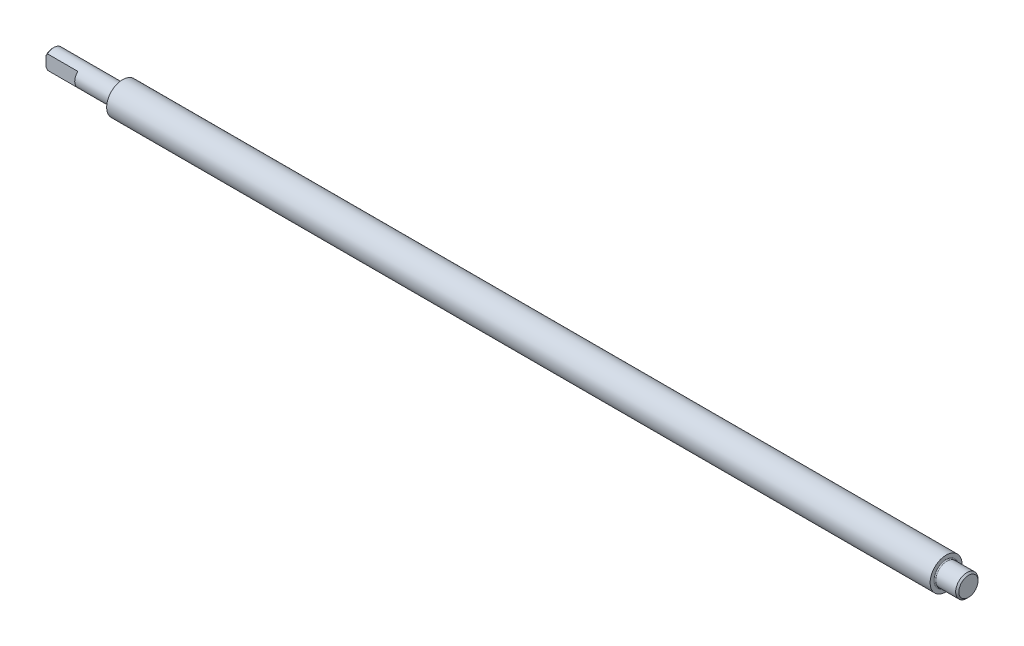
ISO-10303-21;
HEADER;
FILE_DESCRIPTION(('STEP AP214'),'2;1');
FILE_NAME('part.step','',(''),(''),'','','');
FILE_SCHEMA(('AUTOMOTIVE_DESIGN { 1 0 10303 214 1 1 1 1 }'));
ENDSEC;
DATA;
#1=APPLICATION_CONTEXT('core data for automotive mechanical design processes');
#2=APPLICATION_PROTOCOL_DEFINITION('international standard','automotive_design',2000,#1);
#3=PRODUCT_CONTEXT('',#1,'mechanical');
#4=PRODUCT('Part','Part','',(#3));
#5=PRODUCT_RELATED_PRODUCT_CATEGORY('part','',(#4));
#6=PRODUCT_DEFINITION_FORMATION('','',#4);
#7=PRODUCT_DEFINITION_CONTEXT('part definition',#1,'design');
#8=PRODUCT_DEFINITION('design','',#6,#7);
#9=PRODUCT_DEFINITION_SHAPE('','',#8);
#10=(LENGTH_UNIT() NAMED_UNIT(*) SI_UNIT(.MILLI.,.METRE.));
#11=(NAMED_UNIT(*) PLANE_ANGLE_UNIT() SI_UNIT($,.RADIAN.));
#12=(NAMED_UNIT(*) SI_UNIT($,.STERADIAN.) SOLID_ANGLE_UNIT());
#13=UNCERTAINTY_MEASURE_WITH_UNIT(LENGTH_MEASURE(1.E-05),#10,'distance_accuracy_value','');
#14=(GEOMETRIC_REPRESENTATION_CONTEXT(3) GLOBAL_UNCERTAINTY_ASSIGNED_CONTEXT((#13)) GLOBAL_UNIT_ASSIGNED_CONTEXT((#10,
#11,#12)) REPRESENTATION_CONTEXT('',''));
#15=CARTESIAN_POINT('',(0.,0.,0.));
#16=DIRECTION('',(0.,0.,1.));
#17=DIRECTION('',(1.,0.,0.));
#18=AXIS2_PLACEMENT_3D('',#15,#16,#17);
#19=CARTESIAN_POINT('',(280.,0.,0.));
#20=DIRECTION('',(1.,0.,0.));
#21=DIRECTION('',(0.,0.,-1.));
#22=AXIS2_PLACEMENT_3D('',#19,#20,#21);
#23=PLANE('',#22);
#24=CARTESIAN_POINT('',(280.,0.,0.));
#25=DIRECTION('',(1.,0.,0.));
#26=DIRECTION('',(0.,0.,-1.));
#27=AXIS2_PLACEMENT_3D('',#24,#25,#26);
#28=CIRCLE('',#27,3.79999999999988);
#29=CARTESIAN_POINT('',(280.,0.,-3.79999999999988));
#30=VERTEX_POINT('',#29);
#31=EDGE_CURVE('E11',#30,#30,#28,.F.);
#32=ORIENTED_EDGE('',*,*,#31,.T.);
#33=EDGE_LOOP('',(#32));
#34=FACE_BOUND('',#33,.T.);
#35=CARTESIAN_POINT('',(280.,0.,0.));
#36=DIRECTION('',(1.,0.,0.));
#37=DIRECTION('',(0.,0.,-1.));
#38=AXIS2_PLACEMENT_3D('',#35,#36,#37);
#39=CIRCLE('',#38,5.);
#40=CARTESIAN_POINT('',(280.,0.,-5.));
#41=VERTEX_POINT('',#40);
#42=EDGE_CURVE('E82',#41,#41,#39,.T.);
#43=ORIENTED_EDGE('',*,*,#42,.T.);
#44=EDGE_LOOP('',(#43));
#45=FACE_BOUND('',#44,.T.);
#46=ADVANCED_FACE('F33',(#34,#45),#23,.T.);
#47=CARTESIAN_POINT('',(22.,5.,0.));
#48=DIRECTION('',(-1.,0.,0.));
#49=DIRECTION('',(0.,0.,1.));
#50=AXIS2_PLACEMENT_3D('',#47,#48,#49);
#51=PLANE('',#50);
#52=CARTESIAN_POINT('',(22.,0.,0.));
#53=DIRECTION('',(-1.,0.,0.));
#54=DIRECTION('',(0.,0.,1.));
#55=AXIS2_PLACEMENT_3D('',#52,#53,#54);
#56=CIRCLE('',#55,3.29999999999989);
#57=CARTESIAN_POINT('',(22.,0.,3.29999999999989));
#58=VERTEX_POINT('',#57);
#59=EDGE_CURVE('E162',#58,#58,#56,.F.);
#60=ORIENTED_EDGE('',*,*,#59,.T.);
#61=EDGE_LOOP('',(#60));
#62=FACE_BOUND('',#61,.T.);
#63=CARTESIAN_POINT('',(22.,0.,0.));
#64=DIRECTION('',(1.,0.,0.));
#65=DIRECTION('',(0.,0.,-1.));
#66=AXIS2_PLACEMENT_3D('',#63,#64,#65);
#67=CIRCLE('',#66,5.);
#68=CARTESIAN_POINT('',(22.,0.,-5.));
#69=VERTEX_POINT('',#68);
#70=EDGE_CURVE('E88',#69,#69,#67,.T.);
#71=ORIENTED_EDGE('',*,*,#70,.F.);
#72=EDGE_LOOP('',(#71));
#73=FACE_BOUND('',#72,.T.);
#74=ADVANCED_FACE('F130',(#62,#73),#51,.T.);
#75=CARTESIAN_POINT('',(22.,0.,0.));
#76=DIRECTION('',(1.,0.,0.));
#77=DIRECTION('',(0.,0.,-1.));
#78=AXIS2_PLACEMENT_3D('',#75,#76,#77);
#79=CYLINDRICAL_SURFACE('',#78,5.);
#80=ORIENTED_EDGE('',*,*,#70,.T.);
#81=EDGE_LOOP('',(#80));
#82=FACE_BOUND('',#81,.T.);
#83=ORIENTED_EDGE('',*,*,#42,.F.);
#84=EDGE_LOOP('',(#83));
#85=FACE_BOUND('',#84,.T.);
#86=ADVANCED_FACE('F126',(#82,#85),#79,.T.);
#87=CARTESIAN_POINT('',(0.,0.,0.));
#88=DIRECTION('',(1.,0.,0.));
#89=DIRECTION('',(0.,0.,-1.));
#90=AXIS2_PLACEMENT_3D('',#87,#88,#89);
#91=CYLINDRICAL_SURFACE('',#90,3.);
#92=CARTESIAN_POINT('',(21.7000000000001,0.,0.));
#93=DIRECTION('',(-1.,0.,0.));
#94=DIRECTION('',(0.,0.,1.));
#95=AXIS2_PLACEMENT_3D('',#92,#93,#94);
#96=CIRCLE('',#95,3.);
#97=CARTESIAN_POINT('',(21.7000000000001,0.,3.));
#98=VERTEX_POINT('',#97);
#99=EDGE_CURVE('E164',#98,#98,#96,.T.);
#100=ORIENTED_EDGE('',*,*,#99,.T.);
#101=EDGE_LOOP('',(#100));
#102=FACE_BOUND('',#101,.T.);
#103=DIRECTION('',(-1.,0.,0.));
#104=VECTOR('',#103,1.);
#105=CARTESIAN_POINT('',(10.,-2.23606797749979,2.));
#106=LINE('',#105,#104);
#107=CARTESIAN_POINT('',(10.,-2.23606797749979,2.));
#108=VERTEX_POINT('',#107);
#109=CARTESIAN_POINT('',(0.50000000005802,-2.23606797749979,2.));
#110=VERTEX_POINT('',#109);
#111=EDGE_CURVE('E78',#108,#110,#106,.T.);
#112=ORIENTED_EDGE('',*,*,#111,.T.);
#113=CARTESIAN_POINT('',(0.50000000005802,0.,0.));
#114=DIRECTION('',(-1.,0.,0.));
#115=DIRECTION('',(0.,0.,1.));
#116=AXIS2_PLACEMENT_3D('',#113,#114,#115);
#117=CIRCLE('',#116,3.);
#118=CARTESIAN_POINT('',(0.50000000005802,2.23606797749979,2.));
#119=VERTEX_POINT('',#118);
#120=EDGE_CURVE('E48',#110,#119,#117,.F.);
#121=ORIENTED_EDGE('',*,*,#120,.T.);
#122=DIRECTION('',(-1.,0.,0.));
#123=VECTOR('',#122,1.);
#124=CARTESIAN_POINT('',(10.,2.23606797749979,2.));
#125=LINE('',#124,#123);
#126=CARTESIAN_POINT('',(10.,2.23606797749979,2.));
#127=VERTEX_POINT('',#126);
#128=EDGE_CURVE('E76',#127,#119,#125,.T.);
#129=ORIENTED_EDGE('',*,*,#128,.F.);
#130=CARTESIAN_POINT('',(10.,0.,0.));
#131=DIRECTION('',(-1.,0.,0.));
#132=DIRECTION('',(0.,0.,1.));
#133=AXIS2_PLACEMENT_3D('',#130,#131,#132);
#134=CIRCLE('',#133,3.);
#135=EDGE_CURVE('E69',#108,#127,#134,.T.);
#136=ORIENTED_EDGE('',*,*,#135,.F.);
#137=EDGE_LOOP('',(#112,#121,#129,#136));
#138=FACE_BOUND('',#137,.T.);
#139=ADVANCED_FACE('F80',(#102,#138),#91,.T.);
#140=CARTESIAN_POINT('',(0.,0.,0.));
#141=DIRECTION('',(-1.,0.,0.));
#142=DIRECTION('',(0.,0.,1.));
#143=AXIS2_PLACEMENT_3D('',#140,#141,#142);
#144=PLANE('',#143);
#145=DIRECTION('',(0.,-1.,0.));
#146=VECTOR('',#145,1.);
#147=CARTESIAN_POINT('',(0.,2.23606797749979,2.));
#148=LINE('',#147,#146);
#149=CARTESIAN_POINT('',(0.,1.49999999990333,2.));
#150=VERTEX_POINT('',#149);
#151=CARTESIAN_POINT('',(0.,-1.49999999990333,2.));
#152=VERTEX_POINT('',#151);
#153=EDGE_CURVE('E73',#150,#152,#148,.T.);
#154=ORIENTED_EDGE('',*,*,#153,.F.);
#155=CARTESIAN_POINT('',(0.,0.,0.));
#156=DIRECTION('',(-1.,0.,0.));
#157=DIRECTION('',(0.,0.,1.));
#158=AXIS2_PLACEMENT_3D('',#155,#156,#157);
#159=CIRCLE('',#158,2.49999999994199);
#160=EDGE_CURVE('E97',#150,#152,#159,.T.);
#161=ORIENTED_EDGE('',*,*,#160,.T.);
#162=EDGE_LOOP('',(#154,#161));
#163=FACE_BOUND('',#162,.T.);
#164=ADVANCED_FACE('F118',(#163),#144,.T.);
#165=CARTESIAN_POINT('',(10.,2.23606797749979,2.));
#166=DIRECTION('',(0.,0.,-1.));
#167=DIRECTION('',(-1.,0.,0.));
#168=AXIS2_PLACEMENT_3D('',#165,#166,#167);
#169=PLANE('',#168);
#170=ORIENTED_EDGE('',*,*,#153,.T.);
#171=CARTESIAN_POINT('',(0.,-1.49999999990332,2.));
#172=CARTESIAN_POINT('',(0.0382006778610119,-1.56363441032344,2.));
#173=CARTESIAN_POINT('',(0.077507964072937,-1.62658889890878,2.));
#174=CARTESIAN_POINT('',(0.157942702593237,-1.75127191091358,2.));
#175=CARTESIAN_POINT('',(0.199069024909245,-1.81300116186136,2.));
#176=CARTESIAN_POINT('',(0.282789469579817,-1.93543485249902,2.));
#177=CARTESIAN_POINT('',(0.325383344272779,-1.99613946255426,2.));
#178=CARTESIAN_POINT('',(0.411821773743562,-2.11670900844776,2.));
#179=CARTESIAN_POINT('',(0.45566707715367,-2.17657340830223,2.));
#180=CARTESIAN_POINT('',(0.500000000058021,-2.23606797749979,2.));
#181=B_SPLINE_CURVE_WITH_KNOTS('',3,(#171,#172,#173,#174,#175,#176,#177,#178,#179,#180),
.UNSPECIFIED.,.F.,.F.,(4,2,2,2,4),(0.,0.222629901950375,0.445123396105734,0.667579524802105,
0.890171642481118),.UNSPECIFIED.);
#182=EDGE_CURVE('E56',#152,#110,#181,.T.);
#183=ORIENTED_EDGE('',*,*,#182,.T.);
#184=ORIENTED_EDGE('',*,*,#111,.F.);
#185=DIRECTION('',(0.,-1.,0.));
#186=VECTOR('',#185,1.);
#187=CARTESIAN_POINT('',(10.,2.23606797749979,2.));
#188=LINE('',#187,#186);
#189=EDGE_CURVE('E72',#127,#108,#188,.T.);
#190=ORIENTED_EDGE('',*,*,#189,.F.);
#191=ORIENTED_EDGE('',*,*,#128,.T.);
#192=CARTESIAN_POINT('',(0.50000000005802,2.23606797749979,2.));
#193=CARTESIAN_POINT('',(0.45566707715367,2.17657340830223,2.));
#194=CARTESIAN_POINT('',(0.411821773743562,2.11670900844776,2.));
#195=CARTESIAN_POINT('',(0.325383344272779,1.99613946255426,2.));
#196=CARTESIAN_POINT('',(0.282789469579817,1.93543485249902,2.));
#197=CARTESIAN_POINT('',(0.199069024909245,1.81300116186136,2.));
#198=CARTESIAN_POINT('',(0.157942702593237,1.75127191091358,2.));
#199=CARTESIAN_POINT('',(0.0775079640729371,1.62658889890878,2.));
#200=CARTESIAN_POINT('',(0.0382006778610121,1.56363441032344,2.));
#201=CARTESIAN_POINT('',(0.,1.49999999990332,2.));
#202=B_SPLINE_CURVE_WITH_KNOTS('',3,(#192,#193,#194,#195,#196,#197,#198,#199,#200,#201),
.UNSPECIFIED.,.F.,.F.,(4,2,2,2,4),(0.,0.222592117679013,0.445048246375384,0.667541740530743,
0.890171642481118),.UNSPECIFIED.);
#203=EDGE_CURVE('E100',#119,#150,#202,.T.);
#204=ORIENTED_EDGE('',*,*,#203,.T.);
#205=EDGE_LOOP('',(#170,#183,#184,#190,#191,#204));
#206=FACE_BOUND('',#205,.T.);
#207=ADVANCED_FACE('F75',(#206),#169,.F.);
#208=CARTESIAN_POINT('',(10.,0.,0.));
#209=DIRECTION('',(-1.,0.,0.));
#210=DIRECTION('',(0.,0.,1.));
#211=AXIS2_PLACEMENT_3D('',#208,#209,#210);
#212=PLANE('',#211);
#213=ORIENTED_EDGE('',*,*,#135,.T.);
#214=ORIENTED_EDGE('',*,*,#189,.T.);
#215=EDGE_LOOP('',(#213,#214));
#216=FACE_BOUND('',#215,.T.);
#217=ADVANCED_FACE('F71',(#216),#212,.T.);
#218=CARTESIAN_POINT('',(287.,0.,0.));
#219=DIRECTION('',(-1.,0.,0.));
#220=DIRECTION('',(0.,0.,1.));
#221=AXIS2_PLACEMENT_3D('',#218,#219,#220);
#222=CYLINDRICAL_SURFACE('',#221,3.49999999999999);
#223=CARTESIAN_POINT('',(280.3,0.,0.));
#224=DIRECTION('',(1.,0.,0.));
#225=DIRECTION('',(0.,0.,-1.));
#226=AXIS2_PLACEMENT_3D('',#223,#224,#225);
#227=CIRCLE('',#226,3.49999999999999);
#228=CARTESIAN_POINT('',(280.3,0.,3.49999999999999));
#229=VERTEX_POINT('',#228);
#230=EDGE_CURVE('E41',#229,#229,#227,.T.);
#231=CARTESIAN_POINT('',(286.499999999942,0.,0.));
#232=DIRECTION('',(1.,0.,0.));
#233=DIRECTION('',(0.,0.,-1.));
#234=AXIS2_PLACEMENT_3D('',#231,#232,#233);
#235=CIRCLE('',#234,3.49999999999999);
#236=CARTESIAN_POINT('',(286.499999999942,0.,3.49999999999999));
#237=VERTEX_POINT('',#236);
#238=EDGE_CURVE('E94',#237,#237,#235,.F.);
#239=CARTESIAN_POINT('',(280.3,0.,3.49999999999999));
#240=CARTESIAN_POINT('',(280.364583333333,0.,3.49999999999999));
#241=CARTESIAN_POINT('',(280.429166666665,0.,3.49999999999999));
#242=CARTESIAN_POINT('',(280.558333333331,0.,3.49999999999999));
#243=CARTESIAN_POINT('',(280.622916666664,0.,3.49999999999999));
#244=CARTESIAN_POINT('',(280.752083333329,0.,3.49999999999999));
#245=CARTESIAN_POINT('',(280.816666666662,0.,3.49999999999999));
#246=CARTESIAN_POINT('',(280.945833333327,0.,3.49999999999999));
#247=CARTESIAN_POINT('',(281.01041666666,0.,3.49999999999999));
#248=CARTESIAN_POINT('',(281.139583333325,0.,3.49999999999999));
#249=CARTESIAN_POINT('',(281.204166666658,0.,3.49999999999999));
#250=CARTESIAN_POINT('',(281.333333333324,0.,3.49999999999999));
#251=CARTESIAN_POINT('',(281.397916666656,0.,3.49999999999999));
#252=CARTESIAN_POINT('',(281.527083333322,0.,3.49999999999999));
#253=CARTESIAN_POINT('',(281.591666666655,0.,3.49999999999999));
#254=CARTESIAN_POINT('',(281.72083333332,0.,3.49999999999999));
#255=CARTESIAN_POINT('',(281.785416666653,0.,3.49999999999999));
#256=CARTESIAN_POINT('',(281.914583333318,0.,3.49999999999999));
#257=CARTESIAN_POINT('',(281.979166666651,0.,3.49999999999999));
#258=CARTESIAN_POINT('',(282.108333333316,0.,3.49999999999999));
#259=CARTESIAN_POINT('',(282.172916666649,0.,3.49999999999999));
#260=CARTESIAN_POINT('',(282.302083333315,0.,3.49999999999999));
#261=CARTESIAN_POINT('',(282.366666666647,0.,3.49999999999999));
#262=CARTESIAN_POINT('',(282.495833333313,0.,3.49999999999999));
#263=CARTESIAN_POINT('',(282.560416666645,0.,3.49999999999999));
#264=CARTESIAN_POINT('',(282.689583333311,0.,3.49999999999999));
#265=CARTESIAN_POINT('',(282.754166666644,0.,3.49999999999999));
#266=CARTESIAN_POINT('',(282.883333333309,0.,3.49999999999999));
#267=CARTESIAN_POINT('',(282.947916666642,0.,3.49999999999999));
#268=CARTESIAN_POINT('',(283.077083333307,0.,3.49999999999999));
#269=CARTESIAN_POINT('',(283.14166666664,0.,3.49999999999999));
#270=CARTESIAN_POINT('',(283.270833333306,0.,3.49999999999999));
#271=CARTESIAN_POINT('',(283.335416666638,0.,3.49999999999999));
#272=CARTESIAN_POINT('',(283.464583333304,0.,3.49999999999999));
#273=CARTESIAN_POINT('',(283.529166666637,0.,3.49999999999999));
#274=CARTESIAN_POINT('',(283.658333333302,0.,3.49999999999999));
#275=CARTESIAN_POINT('',(283.722916666635,0.,3.49999999999999));
#276=CARTESIAN_POINT('',(283.8520833333,0.,3.49999999999999));
#277=CARTESIAN_POINT('',(283.916666666633,0.,3.49999999999999));
#278=CARTESIAN_POINT('',(284.045833333298,0.,3.49999999999999));
#279=CARTESIAN_POINT('',(284.110416666631,0.,3.49999999999999));
#280=CARTESIAN_POINT('',(284.239583333297,0.,3.49999999999999));
#281=CARTESIAN_POINT('',(284.304166666629,0.,3.49999999999999));
#282=CARTESIAN_POINT('',(284.433333333295,0.,3.49999999999999));
#283=CARTESIAN_POINT('',(284.497916666627,0.,3.49999999999999));
#284=CARTESIAN_POINT('',(284.627083333293,0.,3.49999999999999));
#285=CARTESIAN_POINT('',(284.691666666626,0.,3.49999999999999));
#286=CARTESIAN_POINT('',(284.820833333291,0.,3.49999999999999));
#287=CARTESIAN_POINT('',(284.885416666624,0.,3.49999999999999));
#288=CARTESIAN_POINT('',(285.014583333289,0.,3.49999999999999));
#289=CARTESIAN_POINT('',(285.079166666622,0.,3.49999999999999));
#290=CARTESIAN_POINT('',(285.208333333288,0.,3.49999999999999));
#291=CARTESIAN_POINT('',(285.27291666662,0.,3.49999999999999));
#292=CARTESIAN_POINT('',(285.402083333286,0.,3.49999999999999));
#293=CARTESIAN_POINT('',(285.466666666618,0.,3.49999999999999));
#294=CARTESIAN_POINT('',(285.595833333284,0.,3.49999999999999));
#295=CARTESIAN_POINT('',(285.660416666617,0.,3.49999999999999));
#296=CARTESIAN_POINT('',(285.789583333282,0.,3.49999999999999));
#297=CARTESIAN_POINT('',(285.854166666615,0.,3.49999999999999));
#298=CARTESIAN_POINT('',(285.98333333328,0.,3.49999999999999));
#299=CARTESIAN_POINT('',(286.047916666613,0.,3.49999999999999));
#300=CARTESIAN_POINT('',(286.177083333279,0.,3.49999999999999));
#301=CARTESIAN_POINT('',(286.241666666611,0.,3.49999999999999));
#302=CARTESIAN_POINT('',(286.370833333277,0.,3.49999999999999));
#303=CARTESIAN_POINT('',(286.435416666609,0.,3.49999999999999));
#304=CARTESIAN_POINT('',(286.499999999942,0.,3.49999999999999));
#305=B_SPLINE_CURVE_WITH_KNOTS('',3,(#239,#240,#241,#242,#243,#244,#245,#246,#247,#248,#249,
#250,#251,#252,#253,#254,#255,#256,#257,#258,#259,#260,#261,#262,#263,#264,#265,#266,#267,#268,
#269,#270,#271,#272,#273,#274,#275,#276,#277,#278,#279,#280,#281,#282,#283,#284,#285,#286,#287,
#288,#289,#290,#291,#292,#293,#294,#295,#296,#297,#298,#299,#300,#301,#302,#303,#304),
.UNSPECIFIED.,.F.,.F.,(4,2,2,2,2,2,2,2,2,2,2,2,2,2,2,2,2,2,2,2,2,2,2,2,2,2,2,2,2,2,2,2,4),(0.,
0.193749999998161,0.387499999996377,0.581249999994538,0.774999999992754,0.96874999999097,
1.16249999998913,1.35624999998735,1.54999999998556,1.74374999998372,1.93749999998194,
2.1312499999801,2.32499999997832,2.51874999997653,2.71249999997469,2.90624999997291,
3.09999999997113,3.29374999996929,3.4874999999675,3.68124999996566,3.87499999996388,
4.0687499999621,4.26249999996026,4.45624999995847,4.64999999995669,4.84374999995485,
5.03749999995307,5.23124999995123,5.42499999994944,5.61874999994766,5.81249999994582,
6.00624999994404,6.19999999994225),.UNSPECIFIED.);
#306=EDGE_CURVE('BSEAM147',#229,#237,#305,.T.);
#307=ORIENTED_EDGE('',*,*,#230,.T.);
#308=ORIENTED_EDGE('',*,*,#238,.T.);
#309=ORIENTED_EDGE('',*,*,#306,.T.);
#310=ORIENTED_EDGE('',*,*,#306,.F.);
#311=EDGE_LOOP('',(#307,#309,#308,#310));
#312=FACE_BOUND('',#311,.T.);
#313=ADVANCED_FACE('F147',(#312),#222,.T.);
#314=CARTESIAN_POINT('',(287.,0.,0.));
#315=DIRECTION('',(1.,0.,0.));
#316=DIRECTION('',(0.,0.,-1.));
#317=AXIS2_PLACEMENT_3D('',#314,#315,#316);
#318=PLANE('',#317);
#319=CARTESIAN_POINT('',(287.,0.,0.));
#320=DIRECTION('',(1.,0.,0.));
#321=DIRECTION('',(0.,0.,-1.));
#322=AXIS2_PLACEMENT_3D('',#319,#320,#321);
#323=CIRCLE('',#322,2.99999999994216);
#324=CARTESIAN_POINT('',(287.,0.,-2.99999999994216));
#325=VERTEX_POINT('',#324);
#326=EDGE_CURVE('E91',#325,#325,#323,.T.);
#327=ORIENTED_EDGE('',*,*,#326,.T.);
#328=EDGE_LOOP('',(#327));
#329=FACE_BOUND('',#328,.T.);
#330=ADVANCED_FACE('F139',(#329),#318,.T.);
#331=CARTESIAN_POINT('',(287.,0.,0.));
#332=DIRECTION('',(-1.,0.,0.));
#333=DIRECTION('',(0.,0.,1.));
#334=AXIS2_PLACEMENT_3D('',#331,#332,#333);
#335=CONICAL_SURFACE('',#334,2.99999999994216,0.785398163397436);
#336=ORIENTED_EDGE('',*,*,#238,.F.);
#337=EDGE_LOOP('',(#336));
#338=FACE_BOUND('',#337,.T.);
#339=ORIENTED_EDGE('',*,*,#326,.F.);
#340=EDGE_LOOP('',(#339));
#341=FACE_BOUND('',#340,.T.);
#342=ADVANCED_FACE('F137',(#338,#341),#335,.T.);
#343=CARTESIAN_POINT('',(0.,0.,0.));
#344=DIRECTION('',(1.,0.,0.));
#345=DIRECTION('',(0.,0.,-1.));
#346=AXIS2_PLACEMENT_3D('',#343,#344,#345);
#347=CONICAL_SURFACE('',#346,2.49999999994199,0.785398163397428);
#348=ORIENTED_EDGE('',*,*,#203,.F.);
#349=ORIENTED_EDGE('',*,*,#120,.F.);
#350=ORIENTED_EDGE('',*,*,#182,.F.);
#351=ORIENTED_EDGE('',*,*,#160,.F.);
#352=EDGE_LOOP('',(#348,#349,#350,#351));
#353=FACE_BOUND('',#352,.T.);
#354=ADVANCED_FACE('F111',(#353),#347,.T.);
#355=CARTESIAN_POINT('',(21.7000000000001,0.,0.));
#356=DIRECTION('',(-1.,0.,0.));
#357=DIRECTION('',(0.,0.,1.));
#358=AXIS2_PLACEMENT_3D('',#355,#356,#357);
#359=TOROIDAL_SURFACE('',#358,3.29999999999989,0.299999999999888);
#360=ORIENTED_EDGE('',*,*,#59,.F.);
#361=EDGE_LOOP('',(#360));
#362=FACE_BOUND('',#361,.T.);
#363=ORIENTED_EDGE('',*,*,#99,.F.);
#364=EDGE_LOOP('',(#363));
#365=FACE_BOUND('',#364,.T.);
#366=ADVANCED_FACE('F145',(#362,#365),#359,.F.);
#367=CARTESIAN_POINT('',(280.3,0.,0.));
#368=DIRECTION('',(1.,0.,0.));
#369=DIRECTION('',(0.,0.,-1.));
#370=AXIS2_PLACEMENT_3D('',#367,#368,#369);
#371=TOROIDAL_SURFACE('',#370,3.79999999999988,0.299999999999888);
#372=ORIENTED_EDGE('',*,*,#31,.F.);
#373=EDGE_LOOP('',(#372));
#374=FACE_BOUND('',#373,.T.);
#375=ORIENTED_EDGE('',*,*,#230,.F.);
#376=EDGE_LOOP('',(#375));
#377=FACE_BOUND('',#376,.T.);
#378=ADVANCED_FACE('F35',(#374,#377),#371,.F.);
#379=CLOSED_SHELL('',(#46,#74,#86,#139,#164,#207,#217,#313,#330,#342,#354,#366,#378));
#380=MANIFOLD_SOLID_BREP('B2',#379);
#381=ADVANCED_BREP_SHAPE_REPRESENTATION('',(#18,#380),#14);
#382=SHAPE_DEFINITION_REPRESENTATION(#9,#381);
ENDSEC;
END-ISO-10303-21;
